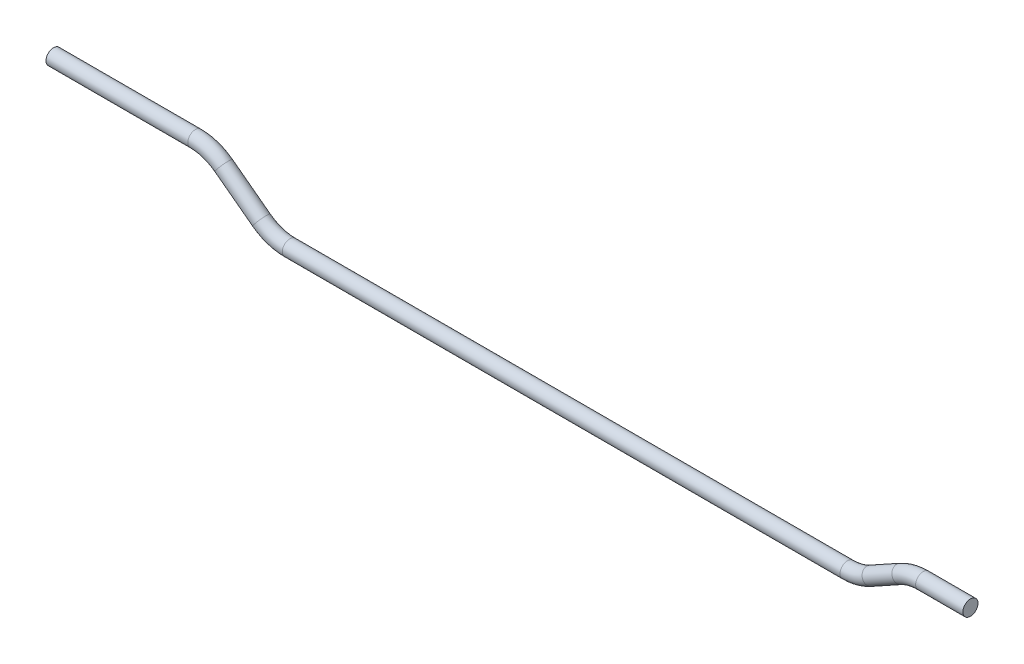
ISO-10303-21;
HEADER;
FILE_DESCRIPTION(('STEP AP214'),'2;1');
FILE_NAME('part.step','',(''),(''),'','','');
FILE_SCHEMA(('AUTOMOTIVE_DESIGN { 1 0 10303 214 1 1 1 1 }'));
ENDSEC;
DATA;
#1=APPLICATION_CONTEXT('core data for automotive mechanical design processes');
#2=APPLICATION_PROTOCOL_DEFINITION('international standard','automotive_design',2000,#1);
#3=PRODUCT_CONTEXT('',#1,'mechanical');
#4=PRODUCT('Part','Part','',(#3));
#5=PRODUCT_RELATED_PRODUCT_CATEGORY('part','',(#4));
#6=PRODUCT_DEFINITION_FORMATION('','',#4);
#7=PRODUCT_DEFINITION_CONTEXT('part definition',#1,'design');
#8=PRODUCT_DEFINITION('design','',#6,#7);
#9=PRODUCT_DEFINITION_SHAPE('','',#8);
#10=(LENGTH_UNIT() NAMED_UNIT(*) SI_UNIT(.MILLI.,.METRE.));
#11=(NAMED_UNIT(*) PLANE_ANGLE_UNIT() SI_UNIT($,.RADIAN.));
#12=(NAMED_UNIT(*) SI_UNIT($,.STERADIAN.) SOLID_ANGLE_UNIT());
#13=UNCERTAINTY_MEASURE_WITH_UNIT(LENGTH_MEASURE(1.E-05),#10,'distance_accuracy_value','');
#14=(GEOMETRIC_REPRESENTATION_CONTEXT(3) GLOBAL_UNCERTAINTY_ASSIGNED_CONTEXT((#13)) GLOBAL_UNIT_ASSIGNED_CONTEXT((#10,
#11,#12)) REPRESENTATION_CONTEXT('',''));
#15=CARTESIAN_POINT('',(0.,0.,0.));
#16=DIRECTION('',(0.,0.,1.));
#17=DIRECTION('',(1.,0.,0.));
#18=AXIS2_PLACEMENT_3D('',#15,#16,#17);
#19=CARTESIAN_POINT('',(92.,-2.00000000000001,0.));
#20=DIRECTION('',(1.,0.,0.));
#21=DIRECTION('',(0.,0.,-1.));
#22=AXIS2_PLACEMENT_3D('',#19,#20,#21);
#23=CYLINDRICAL_SURFACE('',#22,0.8);
#24=CARTESIAN_POINT('',(92.,-2.00000000000001,0.));
#25=DIRECTION('',(1.,0.,0.));
#26=DIRECTION('',(0.,0.,-1.));
#27=AXIS2_PLACEMENT_3D('',#24,#25,#26);
#28=CIRCLE('',#27,0.8);
#29=CARTESIAN_POINT('',(92.,-1.2,0.));
#30=VERTEX_POINT('',#29);
#31=EDGE_CURVE('E37',#30,#30,#28,.T.);
#32=ORIENTED_EDGE('',*,*,#31,.T.);
#33=EDGE_LOOP('',(#32));
#34=FACE_BOUND('',#33,.T.);
#35=CARTESIAN_POINT('',(97.,-2.00000000000001,0.));
#36=DIRECTION('',(1.,0.,0.));
#37=DIRECTION('',(0.,0.,-1.));
#38=AXIS2_PLACEMENT_3D('',#35,#36,#37);
#39=CIRCLE('',#38,0.8);
#40=CARTESIAN_POINT('',(97.,-2.00000000000001,-0.8));
#41=VERTEX_POINT('',#40);
#42=EDGE_CURVE('E10',#41,#41,#39,.T.);
#43=ORIENTED_EDGE('',*,*,#42,.F.);
#44=EDGE_LOOP('',(#43));
#45=FACE_BOUND('',#44,.T.);
#46=ADVANCED_FACE('F31',(#34,#45),#23,.T.);
#47=CARTESIAN_POINT('',(92.,-7.,0.));
#48=DIRECTION('',(0.,0.,-1.));
#49=DIRECTION('',(-1.,0.,0.));
#50=AXIS2_PLACEMENT_3D('',#47,#48,#49);
#51=TOROIDAL_SURFACE('',#50,5.,0.8);
#52=CARTESIAN_POINT('',(89.576940660542,-2.6263535308092,0.));
#53=DIRECTION('',(0.87472929383816,0.484611867891609,0.));
#54=DIRECTION('',(0.,0.,-1.));
#55=AXIS2_PLACEMENT_3D('',#52,#53,#54);
#56=CIRCLE('',#55,0.8);
#57=CARTESIAN_POINT('',(89.1892511662287,-1.92657009573868,0.));
#58=VERTEX_POINT('',#57);
#59=EDGE_CURVE('E41',#58,#58,#56,.T.);
#60=CARTESIAN_POINT('',(92.,-7.,0.));
#61=DIRECTION('',(0.,0.,-1.));
#62=DIRECTION('',(-1.,0.,0.));
#63=AXIS2_PLACEMENT_3D('',#60,#61,#62);
#64=CIRCLE('',#63,5.8);
#65=EDGE_CURVE('',#58,#30,#64,.T.);
#66=ORIENTED_EDGE('',*,*,#59,.T.);
#67=ORIENTED_EDGE('',*,*,#31,.F.);
#68=ORIENTED_EDGE('',*,*,#65,.T.);
#69=ORIENTED_EDGE('',*,*,#65,.F.);
#70=EDGE_LOOP('',(#66,#68,#67,#69));
#71=FACE_BOUND('',#70,.T.);
#72=ADVANCED_FACE('F87',(#71),#51,.T.);
#73=CARTESIAN_POINT('',(86.423059339458,-4.37364646919079,0.));
#74=DIRECTION('',(0.874729293838159,0.48461186789161,0.));
#75=DIRECTION('',(-0.48461186789161,0.874729293838159,0.));
#76=AXIS2_PLACEMENT_3D('',#73,#74,#75);
#77=CYLINDRICAL_SURFACE('',#76,0.8);
#78=CARTESIAN_POINT('',(86.423059339458,-4.37364646919079,0.));
#79=DIRECTION('',(0.87472929383816,0.484611867891609,0.));
#80=DIRECTION('',(0.,0.,-1.));
#81=AXIS2_PLACEMENT_3D('',#78,#79,#80);
#82=CIRCLE('',#81,0.8);
#83=CARTESIAN_POINT('',(86.8107488337713,-5.07342990426132,0.));
#84=VERTEX_POINT('',#83);
#85=EDGE_CURVE('E45',#84,#84,#82,.T.);
#86=ORIENTED_EDGE('',*,*,#85,.T.);
#87=EDGE_LOOP('',(#86));
#88=FACE_BOUND('',#87,.T.);
#89=ORIENTED_EDGE('',*,*,#59,.F.);
#90=EDGE_LOOP('',(#89));
#91=FACE_BOUND('',#90,.T.);
#92=ADVANCED_FACE('F91',(#88,#91),#77,.T.);
#93=CARTESIAN_POINT('',(84.,0.,0.));
#94=DIRECTION('',(0.,0.,1.));
#95=DIRECTION('',(1.,0.,0.));
#96=AXIS2_PLACEMENT_3D('',#93,#94,#95);
#97=TOROIDAL_SURFACE('',#96,5.,0.8);
#98=CARTESIAN_POINT('',(84.,-5.,0.));
#99=DIRECTION('',(1.,0.,0.));
#100=DIRECTION('',(0.,0.,-1.));
#101=AXIS2_PLACEMENT_3D('',#98,#99,#100);
#102=CIRCLE('',#101,0.8);
#103=CARTESIAN_POINT('',(84.,-5.8,0.));
#104=VERTEX_POINT('',#103);
#105=EDGE_CURVE('E50',#104,#104,#102,.T.);
#106=CARTESIAN_POINT('',(84.,0.,0.));
#107=DIRECTION('',(0.,0.,1.));
#108=DIRECTION('',(1.,0.,0.));
#109=AXIS2_PLACEMENT_3D('',#106,#107,#108);
#110=CIRCLE('',#109,5.8);
#111=EDGE_CURVE('',#104,#84,#110,.T.);
#112=ORIENTED_EDGE('',*,*,#105,.T.);
#113=ORIENTED_EDGE('',*,*,#85,.F.);
#114=ORIENTED_EDGE('',*,*,#111,.T.);
#115=ORIENTED_EDGE('',*,*,#111,.F.);
#116=EDGE_LOOP('',(#112,#114,#113,#115));
#117=FACE_BOUND('',#116,.T.);
#118=ADVANCED_FACE('F97',(#117),#97,.T.);
#119=CARTESIAN_POINT('',(25.,-5.,0.));
#120=DIRECTION('',(1.,0.,0.));
#121=DIRECTION('',(0.,0.,-1.));
#122=AXIS2_PLACEMENT_3D('',#119,#120,#121);
#123=CYLINDRICAL_SURFACE('',#122,0.8);
#124=CARTESIAN_POINT('',(25.,-5.,0.));
#125=DIRECTION('',(1.,0.,0.));
#126=DIRECTION('',(0.,0.,-1.));
#127=AXIS2_PLACEMENT_3D('',#124,#125,#126);
#128=CIRCLE('',#127,0.8);
#129=CARTESIAN_POINT('',(25.,-5.8,0.));
#130=VERTEX_POINT('',#129);
#131=EDGE_CURVE('E53',#130,#130,#128,.T.);
#132=ORIENTED_EDGE('',*,*,#131,.T.);
#133=EDGE_LOOP('',(#132));
#134=FACE_BOUND('',#133,.T.);
#135=ORIENTED_EDGE('',*,*,#105,.F.);
#136=EDGE_LOOP('',(#135));
#137=FACE_BOUND('',#136,.T.);
#138=ADVANCED_FACE('F104',(#134,#137),#123,.T.);
#139=CARTESIAN_POINT('',(25.,0.,0.));
#140=DIRECTION('',(0.,0.,1.));
#141=DIRECTION('',(1.,0.,0.));
#142=AXIS2_PLACEMENT_3D('',#139,#140,#141);
#143=TOROIDAL_SURFACE('',#142,5.,0.8);
#144=CARTESIAN_POINT('',(22.,-4.,0.));
#145=DIRECTION('',(0.8,-0.6,0.));
#146=DIRECTION('',(0.,0.,-1.));
#147=AXIS2_PLACEMENT_3D('',#144,#145,#146);
#148=CIRCLE('',#147,0.8);
#149=CARTESIAN_POINT('',(21.52,-4.64,0.));
#150=VERTEX_POINT('',#149);
#151=EDGE_CURVE('E56',#150,#150,#148,.T.);
#152=CARTESIAN_POINT('',(25.,0.,0.));
#153=DIRECTION('',(0.,0.,1.));
#154=DIRECTION('',(1.,0.,0.));
#155=AXIS2_PLACEMENT_3D('',#152,#153,#154);
#156=CIRCLE('',#155,5.8);
#157=EDGE_CURVE('',#150,#130,#156,.T.);
#158=ORIENTED_EDGE('',*,*,#151,.T.);
#159=ORIENTED_EDGE('',*,*,#131,.F.);
#160=ORIENTED_EDGE('',*,*,#157,.T.);
#161=ORIENTED_EDGE('',*,*,#157,.F.);
#162=EDGE_LOOP('',(#158,#160,#159,#161));
#163=FACE_BOUND('',#162,.T.);
#164=ADVANCED_FACE('F108',(#163),#143,.T.);
#165=CARTESIAN_POINT('',(18.,-1.,0.));
#166=DIRECTION('',(0.8,-0.6,0.));
#167=DIRECTION('',(0.6,0.8,0.));
#168=AXIS2_PLACEMENT_3D('',#165,#166,#167);
#169=CYLINDRICAL_SURFACE('',#168,0.8);
#170=CARTESIAN_POINT('',(18.,-1.,0.));
#171=DIRECTION('',(0.8,-0.6,0.));
#172=DIRECTION('',(0.,0.,-1.));
#173=AXIS2_PLACEMENT_3D('',#170,#171,#172);
#174=CIRCLE('',#173,0.8);
#175=CARTESIAN_POINT('',(18.48,-0.360000000000002,0.));
#176=VERTEX_POINT('',#175);
#177=EDGE_CURVE('E59',#176,#176,#174,.T.);
#178=ORIENTED_EDGE('',*,*,#177,.T.);
#179=EDGE_LOOP('',(#178));
#180=FACE_BOUND('',#179,.T.);
#181=ORIENTED_EDGE('',*,*,#151,.F.);
#182=EDGE_LOOP('',(#181));
#183=FACE_BOUND('',#182,.T.);
#184=ADVANCED_FACE('F112',(#180,#183),#169,.T.);
#185=CARTESIAN_POINT('',(15.,-5.,0.));
#186=DIRECTION('',(0.,0.,-1.));
#187=DIRECTION('',(-1.,0.,0.));
#188=AXIS2_PLACEMENT_3D('',#185,#186,#187);
#189=TOROIDAL_SURFACE('',#188,5.,0.8);
#190=CARTESIAN_POINT('',(15.,0.,0.));
#191=DIRECTION('',(1.,0.,0.));
#192=DIRECTION('',(0.,0.,-1.));
#193=AXIS2_PLACEMENT_3D('',#190,#191,#192);
#194=CIRCLE('',#193,0.8);
#195=CARTESIAN_POINT('',(15.,0.8,0.));
#196=VERTEX_POINT('',#195);
#197=EDGE_CURVE('E62',#196,#196,#194,.T.);
#198=CARTESIAN_POINT('',(15.,-5.,0.));
#199=DIRECTION('',(0.,0.,-1.));
#200=DIRECTION('',(-1.,0.,0.));
#201=AXIS2_PLACEMENT_3D('',#198,#199,#200);
#202=CIRCLE('',#201,5.8);
#203=EDGE_CURVE('',#196,#176,#202,.T.);
#204=ORIENTED_EDGE('',*,*,#197,.T.);
#205=ORIENTED_EDGE('',*,*,#177,.F.);
#206=ORIENTED_EDGE('',*,*,#203,.T.);
#207=ORIENTED_EDGE('',*,*,#203,.F.);
#208=EDGE_LOOP('',(#204,#206,#205,#207));
#209=FACE_BOUND('',#208,.T.);
#210=ADVANCED_FACE('F69',(#209),#189,.T.);
#211=CARTESIAN_POINT('',(15.,0.,0.));
#212=DIRECTION('',(-1.,0.,0.));
#213=DIRECTION('',(0.,0.,1.));
#214=AXIS2_PLACEMENT_3D('',#211,#212,#213);
#215=CYLINDRICAL_SURFACE('',#214,0.8);
#216=ORIENTED_EDGE('',*,*,#197,.F.);
#217=EDGE_LOOP('',(#216));
#218=FACE_BOUND('',#217,.T.);
#219=CARTESIAN_POINT('',(0.,0.,0.));
#220=DIRECTION('',(1.,0.,0.));
#221=DIRECTION('',(0.,0.,-1.));
#222=AXIS2_PLACEMENT_3D('',#219,#220,#221);
#223=CIRCLE('',#222,0.8);
#224=CARTESIAN_POINT('',(0.,0.,-0.8));
#225=VERTEX_POINT('',#224);
#226=EDGE_CURVE('E63',#225,#225,#223,.T.);
#227=ORIENTED_EDGE('',*,*,#226,.T.);
#228=EDGE_LOOP('',(#227));
#229=FACE_BOUND('',#228,.T.);
#230=ADVANCED_FACE('F72',(#218,#229),#215,.T.);
#231=CARTESIAN_POINT('',(97.,-2.00000000000001,0.));
#232=DIRECTION('',(1.,0.,0.));
#233=DIRECTION('',(0.,0.,-1.));
#234=AXIS2_PLACEMENT_3D('',#231,#232,#233);
#235=PLANE('',#234);
#236=ORIENTED_EDGE('',*,*,#42,.T.);
#237=EDGE_LOOP('',(#236));
#238=FACE_BOUND('',#237,.T.);
#239=ADVANCED_FACE('F75',(#238),#235,.T.);
#240=CARTESIAN_POINT('',(0.,0.,0.));
#241=DIRECTION('',(1.,0.,0.));
#242=DIRECTION('',(0.,0.,-1.));
#243=AXIS2_PLACEMENT_3D('',#240,#241,#242);
#244=PLANE('',#243);
#245=ORIENTED_EDGE('',*,*,#226,.F.);
#246=EDGE_LOOP('',(#245));
#247=FACE_BOUND('',#246,.T.);
#248=ADVANCED_FACE('F79',(#247),#244,.F.);
#249=CLOSED_SHELL('',(#46,#72,#92,#118,#138,#164,#184,#210,#230,#239,#248));
#250=MANIFOLD_SOLID_BREP('B2',#249);
#251=ADVANCED_BREP_SHAPE_REPRESENTATION('',(#18,#250),#14);
#252=SHAPE_DEFINITION_REPRESENTATION(#9,#251);
ENDSEC;
END-ISO-10303-21;
